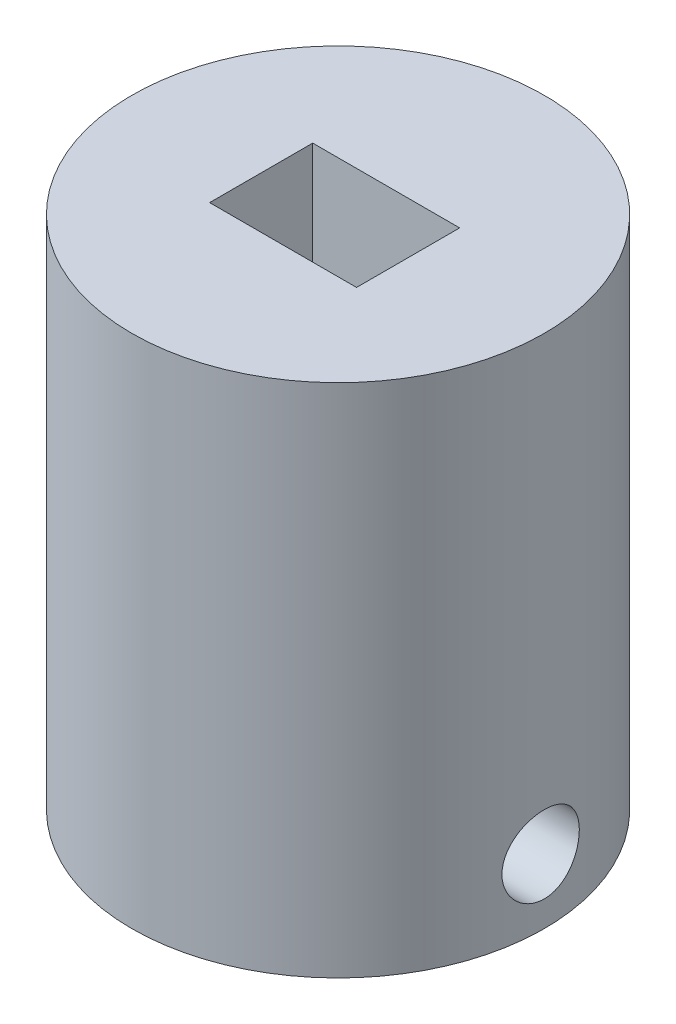
ISO-10303-21;
HEADER;
FILE_DESCRIPTION(('STEP AP214'),'2;1');
FILE_NAME('part.step','',(''),(''),'','','');
FILE_SCHEMA(('AUTOMOTIVE_DESIGN { 1 0 10303 214 1 1 1 1 }'));
ENDSEC;
DATA;
#1=APPLICATION_CONTEXT('core data for automotive mechanical design processes');
#2=APPLICATION_PROTOCOL_DEFINITION('international standard','automotive_design',2000,#1);
#3=PRODUCT_CONTEXT('',#1,'mechanical');
#4=PRODUCT('Part','Part','',(#3));
#5=PRODUCT_RELATED_PRODUCT_CATEGORY('part','',(#4));
#6=PRODUCT_DEFINITION_FORMATION('','',#4);
#7=PRODUCT_DEFINITION_CONTEXT('part definition',#1,'design');
#8=PRODUCT_DEFINITION('design','',#6,#7);
#9=PRODUCT_DEFINITION_SHAPE('','',#8);
#10=(LENGTH_UNIT() NAMED_UNIT(*) SI_UNIT(.MILLI.,.METRE.));
#11=(NAMED_UNIT(*) PLANE_ANGLE_UNIT() SI_UNIT($,.RADIAN.));
#12=(NAMED_UNIT(*) SI_UNIT($,.STERADIAN.) SOLID_ANGLE_UNIT());
#13=UNCERTAINTY_MEASURE_WITH_UNIT(LENGTH_MEASURE(1.E-05),#10,'distance_accuracy_value','');
#14=(GEOMETRIC_REPRESENTATION_CONTEXT(3) GLOBAL_UNCERTAINTY_ASSIGNED_CONTEXT((#13)) GLOBAL_UNIT_ASSIGNED_CONTEXT((#10,
#11,#12)) REPRESENTATION_CONTEXT('',''));
#15=CARTESIAN_POINT('',(0.,0.,0.));
#16=DIRECTION('',(0.,0.,1.));
#17=DIRECTION('',(1.,0.,0.));
#18=AXIS2_PLACEMENT_3D('',#15,#16,#17);
#19=CARTESIAN_POINT('',(0.,20.,0.));
#20=DIRECTION('',(0.,-1.,0.));
#21=DIRECTION('',(0.,0.,-1.));
#22=AXIS2_PLACEMENT_3D('',#19,#20,#21);
#23=CYLINDRICAL_SURFACE('',#22,8.);
#24=CARTESIAN_POINT('',(-8.,1.,0.));
#25=CARTESIAN_POINT('',(-7.99999848833852,1.00000318958828,-0.0834717464654709));
#26=CARTESIAN_POINT('',(-7.99868009921714,1.00699107661938,-0.166984992730098));
#27=CARTESIAN_POINT('',(-7.9935478589052,1.03473999511835,-0.331658129841798));
#28=CARTESIAN_POINT('',(-7.98973190166897,1.05551265063973,-0.412815974152226));
#29=CARTESIAN_POINT('',(-7.98003138765458,1.11017270125934,-0.570372961851801));
#30=CARTESIAN_POINT('',(-7.97414869946483,1.14404825245254,-0.646776330685344));
#31=CARTESIAN_POINT('',(-7.96095710599783,1.22391887692282,-0.792807973094006));
#32=CARTESIAN_POINT('',(-7.9536483161829,1.26991296914482,-0.862436794477323));
#33=CARTESIAN_POINT('',(-7.93831336430504,1.37329976800367,-0.993783715930503));
#34=CARTESIAN_POINT('',(-7.93028034856351,1.43080944467014,-1.05540895503183));
#35=CARTESIAN_POINT('',(-7.9144531845865,1.55534330908756,-1.16819606135369));
#36=CARTESIAN_POINT('',(-7.90665905354527,1.62236817976929,-1.21935717689241));
#37=CARTESIAN_POINT('',(-7.89212551245005,1.76468608836397,-1.31014998665793));
#38=CARTESIAN_POINT('',(-7.88539493886182,1.84004037031724,-1.34968721969605));
#39=CARTESIAN_POINT('',(-7.87384713211987,1.99646891517679,-1.41550524332283));
#40=CARTESIAN_POINT('',(-7.86902973396962,2.07754268411122,-1.44178717713098));
#41=CARTESIAN_POINT('',(-7.8619226957455,2.24211523091441,-1.480050535035));
#42=CARTESIAN_POINT('',(-7.85960445366405,2.32557509720346,-1.49219390192039));
#43=CARTESIAN_POINT('',(-7.85767197152761,2.49337738480825,-1.50233808095346));
#44=CARTESIAN_POINT('',(-7.8580574889876,2.5777197263023,-1.50034016135374));
#45=CARTESIAN_POINT('',(-7.86146292701753,2.74371952526605,-1.48238979602362));
#46=CARTESIAN_POINT('',(-7.86444808147334,2.82539771430015,-1.46662149996045));
#47=CARTESIAN_POINT('',(-7.87266183284666,2.98492841978261,-1.42186799396207));
#48=CARTESIAN_POINT('',(-7.87789052509516,3.0627807735093,-1.39288222239499));
#49=CARTESIAN_POINT('',(-7.89003855292589,3.21298867900027,-1.322336471793));
#50=CARTESIAN_POINT('',(-7.89696783823366,3.28530847058081,-1.28070213532456));
#51=CARTESIAN_POINT('',(-7.91172971602918,3.42200472854023,-1.18609368930416));
#52=CARTESIAN_POINT('',(-7.91956240015522,3.4863803877148,-1.13311842889266));
#53=CARTESIAN_POINT('',(-7.93540001272164,3.60642495567246,-1.01633905685298));
#54=CARTESIAN_POINT('',(-7.94340571024031,3.66194065245174,-0.952377436860682));
#55=CARTESIAN_POINT('',(-7.95857386108318,3.76147724067541,-0.815968037098826));
#56=CARTESIAN_POINT('',(-7.96573630595245,3.80549801687042,-0.743520172255769));
#57=CARTESIAN_POINT('',(-7.97842539677509,3.88081775387002,-0.592034988874667));
#58=CARTESIAN_POINT('',(-7.98394999136289,3.9121007791179,-0.512989564446493));
#59=CARTESIAN_POINT('',(-7.99272505402719,3.96090209309216,-0.350639115398696));
#60=CARTESIAN_POINT('',(-7.99597576367994,3.97842184404536,-0.267334544277786));
#61=CARTESIAN_POINT('',(-7.99980360641981,3.99898603101827,-0.100148652903384));
#62=CARTESIAN_POINT('',(-8.00041950912279,4.00224039152973,-0.0162940126341342));
#63=CARTESIAN_POINT('',(-7.99901543598228,3.99474452045235,0.150761248092185));
#64=CARTESIAN_POINT('',(-7.99699558964431,3.98399497693474,0.233961900480386));
#65=CARTESIAN_POINT('',(-7.99057111500406,3.94897096481663,0.396681573218218));
#66=CARTESIAN_POINT('',(-7.98618522374031,3.92480271746219,0.476224261046064));
#67=CARTESIAN_POINT('',(-7.97551842212498,3.86374229322121,0.630128631824634));
#68=CARTESIAN_POINT('',(-7.96923738311334,3.82684925243421,0.704489962595104));
#69=CARTESIAN_POINT('',(-7.95538030357666,3.74092187184049,0.846816671513215));
#70=CARTESIAN_POINT('',(-7.94779086174563,3.69175926146316,0.914703277015122));
#71=CARTESIAN_POINT('',(-7.93219343489711,3.58286186263764,1.04133832326455));
#72=CARTESIAN_POINT('',(-7.92418541084687,3.52312608699867,1.10008590976087));
#73=CARTESIAN_POINT('',(-7.9085247569745,3.39382768108857,1.20757295872048));
#74=CARTESIAN_POINT('',(-7.90087825860257,3.32414509187461,1.25616916218577));
#75=CARTESIAN_POINT('',(-7.88692985578532,3.17748237547625,1.34096675057787));
#76=CARTESIAN_POINT('',(-7.8806279013735,3.10050251962953,1.37716859613924));
#77=CARTESIAN_POINT('',(-7.87013024209574,2.94179413275746,1.43594673512823));
#78=CARTESIAN_POINT('',(-7.86592440436878,2.86009062044067,1.45858868794786));
#79=CARTESIAN_POINT('',(-7.86007203802415,2.6939527774786,1.48980679326235));
#80=CARTESIAN_POINT('',(-7.8584252206579,2.6095187560296,1.49838453270708));
#81=CARTESIAN_POINT('',(-7.85789199803857,2.44175166855849,1.50117762148355));
#82=CARTESIAN_POINT('',(-7.85896215974293,2.358422419043,1.49561895003499));
#83=CARTESIAN_POINT('',(-7.86364600659998,2.19390857795471,1.47079175378803));
#84=CARTESIAN_POINT('',(-7.86725967655747,2.11272397357256,1.45152331089332));
#85=CARTESIAN_POINT('',(-7.8766050802318,1.95492551520452,1.39991887583263));
#86=CARTESIAN_POINT('',(-7.88233284594965,1.87830340865423,1.36760735397252));
#87=CARTESIAN_POINT('',(-7.8952638755184,1.73153174575916,1.29085868912204));
#88=CARTESIAN_POINT('',(-7.90246724360119,1.66138264715522,1.24642068948186));
#89=CARTESIAN_POINT('',(-7.91767266107745,1.52841631995771,1.14589487339535));
#90=CARTESIAN_POINT('',(-7.92568505353043,1.4657245874329,1.08964259864303));
#91=CARTESIAN_POINT('',(-7.94152833918735,1.35059483753548,0.96742792674229));
#92=CARTESIAN_POINT('',(-7.94935919027328,1.29815917901986,0.901463301891614));
#93=CARTESIAN_POINT('',(-7.96403975968049,1.20458904737294,0.760984945071871));
#94=CARTESIAN_POINT('',(-7.97088000990561,1.16356057150936,0.686399590640516));
#95=CARTESIAN_POINT('',(-7.98271619380687,1.09468236339486,0.531290113653833));
#96=CARTESIAN_POINT('',(-7.98771385879037,1.06682025295309,0.450771651705247));
#97=CARTESIAN_POINT('',(-7.99428290707632,1.03072268558133,0.308347202825153));
#98=CARTESIAN_POINT('',(-7.99641470878206,1.0192213696872,0.24727381025187));
#99=CARTESIAN_POINT('',(-7.9992737995401,1.00385893788355,0.124141247115158));
#100=CARTESIAN_POINT('',(-8.00000112429805,0.999997627744093,0.0620821016527093));
#101=CARTESIAN_POINT('',(-8.,1.,0.));
#102=B_SPLINE_CURVE_WITH_KNOTS('',3,(#24,#25,#26,#27,#28,#29,#30,#31,#32,#33,#34,#35,#36,#37,
#38,#39,#40,#41,#42,#43,#44,#45,#46,#47,#48,#49,#50,#51,#52,#53,#54,#55,#56,#57,#58,#59,#60,#61,
#62,#63,#64,#65,#66,#67,#68,#69,#70,#71,#72,#73,#74,#75,#76,#77,#78,#79,#80,#81,#82,#83,#84,#85,
#86,#87,#88,#89,#90,#91,#92,#93,#94,#95,#96,#97,#98,#99,#100,#101),.UNSPECIFIED.,.T.,.F.,(4,2,2,
2,2,2,2,2,2,2,2,2,2,2,2,2,2,2,2,2,2,2,2,2,2,2,2,2,2,2,2,2,2,2,2,2,2,2,4),(0.,0.250188200964924,
0.500587642535452,0.750761271230907,1.00091465336891,1.2537511801363,1.50660586283617,
1.76146190504358,2.01629596311949,2.26818151445336,2.52004447587256,2.76859000612766,
3.01714609846787,3.26719262629531,3.51726454049859,3.77127768464077,4.02529337544948,
4.27962588321699,4.53393136673745,4.78448174076097,5.03501980464583,5.28360233907828,
5.53220175338032,5.78351778017708,6.03485728413098,6.28953436987299,6.54420198954945,
6.79762627818559,7.05102196946513,7.30039252231748,7.54976158541507,7.79866496207693,
8.04758592655423,8.3002336996638,8.55293951262255,8.80792048916314,9.06266126931173,
9.24874344524409,9.43482089039541),.UNSPECIFIED.);
#103=CARTESIAN_POINT('',(-8.,1.,0.));
#104=VERTEX_POINT('',#103);
#105=EDGE_CURVE('E129',#104,#104,#102,.T.);
#106=ORIENTED_EDGE('',*,*,#105,.T.);
#107=EDGE_LOOP('',(#106));
#108=FACE_BOUND('',#107,.T.);
#109=CARTESIAN_POINT('',(7.85811682275086,2.5,-1.5));
#110=CARTESIAN_POINT('',(7.85811843793494,2.41654279198826,-1.49999679883246));
#111=CARTESIAN_POINT('',(7.85946079760266,2.33304405178161,-1.49301126348936));
#112=CARTESIAN_POINT('',(7.86467851014364,2.16840103841809,-1.46527253251805));
#113=CARTESIAN_POINT('',(7.86855601173205,2.08725882357252,-1.44450765768477));
#114=CARTESIAN_POINT('',(7.87838976464885,1.92973492862913,-1.38987035617788));
#115=CARTESIAN_POINT('',(7.88434407905997,1.85334889069271,-1.35601013954374));
#116=CARTESIAN_POINT('',(7.89765826320959,1.70734644071319,-1.27617565760366));
#117=CARTESIAN_POINT('',(7.90501802325622,1.6377295009967,-1.23020233759193));
#118=CARTESIAN_POINT('',(7.92041614838944,1.50636980080087,-1.12683678942622));
#119=CARTESIAN_POINT('',(7.92846116625679,1.44472351652827,-1.06932292933092));
#120=CARTESIAN_POINT('',(7.94426457664034,1.33189561040044,-0.944771778803551));
#121=CARTESIAN_POINT('',(7.95202295031153,1.28071467557521,-0.877733863624944));
#122=CARTESIAN_POINT('',(7.96645017828405,1.18990062339948,-0.735403894570162));
#123=CARTESIAN_POINT('',(7.97311028052363,1.15035846648058,-0.660052840033866));
#124=CARTESIAN_POINT('',(7.98451608632931,1.08453045772647,-0.503631283250763));
#125=CARTESIAN_POINT('',(7.98926194728334,1.05824351600978,-0.422561251859506));
#126=CARTESIAN_POINT('',(7.99625755123778,1.01997045138887,-0.258002746187416));
#127=CARTESIAN_POINT('',(7.99853565976327,1.00782169407732,-0.174553323244857));
#128=CARTESIAN_POINT('',(8.00043684615594,0.997663112299599,-0.00677167603538324));
#129=CARTESIAN_POINT('',(8.00006015010697,0.999652083860943,0.0775604724476702));
#130=CARTESIAN_POINT('',(7.99671633763241,1.01758777114715,0.243598357899397));
#131=CARTESIAN_POINT('',(7.99378172247214,1.03335936943001,0.325323760451469));
#132=CARTESIAN_POINT('',(7.98568826333561,1.07813564939524,0.484947165715475));
#133=CARTESIAN_POINT('',(7.98052933829966,1.1071408133458,0.562845028826541));
#134=CARTESIAN_POINT('',(7.96851260297339,1.1777277310583,0.713110065751521));
#135=CARTESIAN_POINT('',(7.96164537590825,1.2193794879125,0.785443571838533));
#136=CARTESIAN_POINT('',(7.9469714754285,1.31402566907715,0.922159977214638));
#137=CARTESIAN_POINT('',(7.93916470651164,1.36702124688758,0.986542066910785));
#138=CARTESIAN_POINT('',(7.92333513680567,1.48381570298353,1.10656561896904));
#139=CARTESIAN_POINT('',(7.91531085901621,1.54776778390207,1.16205790757041));
#140=CARTESIAN_POINT('',(7.9000650892462,1.68414953127862,1.2615517185126));
#141=CARTESIAN_POINT('',(7.89284360901351,1.75657932176463,1.30555307271182));
#142=CARTESIAN_POINT('',(7.88001893307121,1.90805827070266,1.38085852224478));
#143=CARTESIAN_POINT('',(7.87441850530261,1.98711845719064,1.41214093645421));
#144=CARTESIAN_POINT('',(7.86551242396689,2.1495011841232,1.46093656975056));
#145=CARTESIAN_POINT('',(7.8622065103862,2.23282324046478,1.47845134901108));
#146=CARTESIAN_POINT('',(7.85831520301005,2.40001932885588,1.49899672649739));
#147=CARTESIAN_POINT('',(7.85768955816137,2.48386611556551,1.50224164285859));
#148=CARTESIAN_POINT('',(7.8591219142084,2.65090345508715,1.49472968881724));
#149=CARTESIAN_POINT('',(7.86117978238611,2.73409404014808,1.48397351086433));
#150=CARTESIAN_POINT('',(7.86770980063205,2.89675290305439,1.44894868195883));
#151=CARTESIAN_POINT('',(7.87216186690878,2.97624625262489,1.4247923858399));
#152=CARTESIAN_POINT('',(7.88296134156619,3.13005718973016,1.3637722437906));
#153=CARTESIAN_POINT('',(7.88930888963281,3.20437439531533,1.32690746128795));
#154=CARTESIAN_POINT('',(7.90327577863685,3.34666761904317,1.2410235311966));
#155=CARTESIAN_POINT('',(7.91090895425315,3.41456053786607,1.19186899639621));
#156=CARTESIAN_POINT('',(7.926548113681,3.54121204021433,1.08298344344247));
#157=CARTESIAN_POINT('',(7.93455413096494,3.59996980155577,1.02325147433084));
#158=CARTESIAN_POINT('',(7.95016624005946,3.70748376353413,0.893949417870386));
#159=CARTESIAN_POINT('',(7.95776555833305,3.75609582660596,0.824258534095891));
#160=CARTESIAN_POINT('',(7.97159404810351,3.84092120617766,0.677574523040141));
#161=CARTESIAN_POINT('',(7.97782327234725,3.87713500002501,0.600581677038529));
#162=CARTESIAN_POINT('',(7.98818057995848,3.93592009786408,0.441877541578684));
#163=CARTESIAN_POINT('',(7.99231954730142,3.95856218756141,0.360193213078988));
#164=CARTESIAN_POINT('',(7.99807642083745,3.98978704828989,0.194096227381571));
#165=CARTESIAN_POINT('',(7.99969459229933,3.99837129866271,0.109683858215851));
#166=CARTESIAN_POINT('',(8.00022227515441,4.00118530151844,-0.0580907602505092));
#167=CARTESIAN_POINT('',(7.99917286625032,3.99563275312953,-0.141449307066268));
#168=CARTESIAN_POINT('',(7.99456866611703,3.97080757223157,-0.306023369279199));
#169=CARTESIAN_POINT('',(7.99101389890671,3.95153507125579,-0.387238905213689));
#170=CARTESIAN_POINT('',(7.98179837978045,3.89990879261628,-0.545106475595484));
#171=CARTESIAN_POINT('',(7.97614135981576,3.86757818711899,-0.621766319318223));
#172=CARTESIAN_POINT('',(7.96333372068771,3.79077954634482,-0.768605631316694));
#173=CARTESIAN_POINT('',(7.95618300146483,3.74631069789335,-0.83878466500327));
#174=CARTESIAN_POINT('',(7.94104779859941,3.64574854555768,-0.971755027780006));
#175=CARTESIAN_POINT('',(7.93305284591272,3.58949796613829,-1.03442623539053));
#176=CARTESIAN_POINT('',(7.91719633538833,3.46729543750729,-1.14951536065485));
#177=CARTESIAN_POINT('',(7.90933480936765,3.40134120962628,-1.2019308632478));
#178=CARTESIAN_POINT('',(7.89455577425926,3.26087354529666,-1.29547633945385));
#179=CARTESIAN_POINT('',(7.88764767280729,3.18628656033236,-1.33649740531872));
#180=CARTESIAN_POINT('',(7.87567084650033,3.03117421002026,-1.40536132423417));
#181=CARTESIAN_POINT('',(7.87060038649116,2.95065453341062,-1.43321661638912));
#182=CARTESIAN_POINT('',(7.86393016292125,2.80824771193409,-1.46929726596175));
#183=CARTESIAN_POINT('',(7.86176310717932,2.74719427623806,-1.4807910573985));
#184=CARTESIAN_POINT('',(7.85885585595504,2.62410153157968,-1.49614351076215));
#185=CARTESIAN_POINT('',(7.85811562163282,2.56206224949967,-1.50000238052127));
#186=CARTESIAN_POINT('',(7.85811682275086,2.5,-1.5));
#187=B_SPLINE_CURVE_WITH_KNOTS('',3,(#109,#110,#111,#112,#113,#114,#115,#116,#117,#118,#119,
#120,#121,#122,#123,#124,#125,#126,#127,#128,#129,#130,#131,#132,#133,#134,#135,#136,#137,#138,
#139,#140,#141,#142,#143,#144,#145,#146,#147,#148,#149,#150,#151,#152,#153,#154,#155,#156,#157,
#158,#159,#160,#161,#162,#163,#164,#165,#166,#167,#168,#169,#170,#171,#172,#173,#174,#175,#176,
#177,#178,#179,#180,#181,#182,#183,#184,#185,#186),.UNSPECIFIED.,.T.,.F.,(4,2,2,2,2,2,2,2,2,2,2,
2,2,2,2,2,2,2,2,2,2,2,2,2,2,2,2,2,2,2,2,2,2,2,2,2,2,2,4),(0.,0.250144505793186,
0.500501302380393,0.750625227978432,1.00072963993908,1.25362335698691,1.50653367069315,
1.76137104348047,2.0161874593964,2.26804275460261,2.51987660200648,2.76855650598725,
3.01724547328425,3.26733691984219,3.51745380911785,3.77140614764064,4.025362201924,
4.27974936118266,4.53410768866488,4.78463248587075,5.03514489338718,5.28358792315368,
5.53204926624317,5.78337862654143,6.03473059394677,6.2894412549587,6.54414210821705,
6.79750269418683,7.0508366166733,7.30029300570138,7.54974700322167,7.79876026530357,
8.0477902135711,8.30038464008745,8.55303847730764,8.80803001818117,9.06278015749119,
9.24880307527214,9.43482092920425),.UNSPECIFIED.);
#188=CARTESIAN_POINT('',(7.85811682275086,2.5,-1.5));
#189=VERTEX_POINT('',#188);
#190=EDGE_CURVE('E123',#189,#189,#187,.T.);
#191=ORIENTED_EDGE('',*,*,#190,.T.);
#192=EDGE_LOOP('',(#191));
#193=FACE_BOUND('',#192,.T.);
#194=CARTESIAN_POINT('',(0.,20.,0.));
#195=DIRECTION('',(0.,1.,0.));
#196=DIRECTION('',(0.,0.,1.));
#197=AXIS2_PLACEMENT_3D('',#194,#195,#196);
#198=CIRCLE('',#197,8.);
#199=CARTESIAN_POINT('',(0.,20.,8.));
#200=VERTEX_POINT('',#199);
#201=EDGE_CURVE('E11',#200,#200,#198,.T.);
#202=ORIENTED_EDGE('',*,*,#201,.F.);
#203=EDGE_LOOP('',(#202));
#204=FACE_BOUND('',#203,.T.);
#205=CARTESIAN_POINT('',(0.,0.,0.));
#206=DIRECTION('',(0.,1.,0.));
#207=DIRECTION('',(0.,0.,1.));
#208=AXIS2_PLACEMENT_3D('',#205,#206,#207);
#209=CIRCLE('',#208,8.);
#210=CARTESIAN_POINT('',(0.,0.,8.));
#211=VERTEX_POINT('',#210);
#212=EDGE_CURVE('E51',#211,#211,#209,.T.);
#213=ORIENTED_EDGE('',*,*,#212,.T.);
#214=EDGE_LOOP('',(#213));
#215=FACE_BOUND('',#214,.T.);
#216=ADVANCED_FACE('F37',(#108,#193,#204,#215),#23,.T.);
#217=CARTESIAN_POINT('',(0.,20.,0.));
#218=DIRECTION('',(0.,1.,0.));
#219=DIRECTION('',(0.,0.,1.));
#220=AXIS2_PLACEMENT_3D('',#217,#218,#219);
#221=PLANE('',#220);
#222=DIRECTION('',(0.,0.,1.));
#223=VECTOR('',#222,1.);
#224=CARTESIAN_POINT('',(-2.88443974171694,20.,-1.90183485412021));
#225=LINE('',#224,#223);
#226=CARTESIAN_POINT('',(-2.88443974171694,20.,-1.90183485412021));
#227=VERTEX_POINT('',#226);
#228=CARTESIAN_POINT('',(-2.88443974171694,20.,2.09816514587979));
#229=VERTEX_POINT('',#228);
#230=EDGE_CURVE('E59',#227,#229,#225,.T.);
#231=ORIENTED_EDGE('',*,*,#230,.F.);
#232=DIRECTION('',(-1.,0.,0.));
#233=VECTOR('',#232,1.);
#234=CARTESIAN_POINT('',(-2.88443974171694,20.,-1.90183485412021));
#235=LINE('',#234,#233);
#236=CARTESIAN_POINT('',(2.81556025828306,20.,-1.90183485412021));
#237=VERTEX_POINT('',#236);
#238=EDGE_CURVE('E110',#237,#227,#235,.T.);
#239=ORIENTED_EDGE('',*,*,#238,.F.);
#240=DIRECTION('',(0.,0.,-1.));
#241=VECTOR('',#240,1.);
#242=CARTESIAN_POINT('',(2.81556025828306,20.,-1.90183485412021));
#243=LINE('',#242,#241);
#244=CARTESIAN_POINT('',(2.81556025828306,20.,2.09816514587979));
#245=VERTEX_POINT('',#244);
#246=EDGE_CURVE('E116',#245,#237,#243,.T.);
#247=ORIENTED_EDGE('',*,*,#246,.F.);
#248=DIRECTION('',(1.,0.,0.));
#249=VECTOR('',#248,1.);
#250=CARTESIAN_POINT('',(-2.88443974171694,20.,2.09816514587979));
#251=LINE('',#250,#249);
#252=EDGE_CURVE('E94',#229,#245,#251,.T.);
#253=ORIENTED_EDGE('',*,*,#252,.F.);
#254=EDGE_LOOP('',(#231,#239,#247,#253));
#255=FACE_BOUND('',#254,.T.);
#256=ORIENTED_EDGE('',*,*,#201,.T.);
#257=EDGE_LOOP('',(#256));
#258=FACE_BOUND('',#257,.T.);
#259=ADVANCED_FACE('F158',(#255,#258),#221,.T.);
#260=CARTESIAN_POINT('',(0.,0.,0.));
#261=DIRECTION('',(0.,1.,0.));
#262=DIRECTION('',(0.,0.,1.));
#263=AXIS2_PLACEMENT_3D('',#260,#261,#262);
#264=PLANE('',#263);
#265=CARTESIAN_POINT('',(0.,0.,0.));
#266=DIRECTION('',(0.,-1.,0.));
#267=DIRECTION('',(0.,0.,-1.));
#268=AXIS2_PLACEMENT_3D('',#265,#266,#267);
#269=CIRCLE('',#268,4.);
#270=CARTESIAN_POINT('',(0.,0.,-4.));
#271=VERTEX_POINT('',#270);
#272=EDGE_CURVE('E183',#271,#271,#269,.T.);
#273=ORIENTED_EDGE('',*,*,#272,.F.);
#274=EDGE_LOOP('',(#273));
#275=FACE_BOUND('',#274,.T.);
#276=ORIENTED_EDGE('',*,*,#212,.F.);
#277=EDGE_LOOP('',(#276));
#278=FACE_BOUND('',#277,.T.);
#279=ADVANCED_FACE('F156',(#275,#278),#264,.F.);
#280=CARTESIAN_POINT('',(0.,12.,0.));
#281=DIRECTION('',(0.,-1.,0.));
#282=DIRECTION('',(0.,0.,-1.));
#283=AXIS2_PLACEMENT_3D('',#280,#281,#282);
#284=CYLINDRICAL_SURFACE('',#283,4.);
#285=CARTESIAN_POINT('',(-3.70809924354783,2.5,-1.5));
#286=CARTESIAN_POINT('',(-3.70809640633806,2.41899251627921,-1.50000304106109));
#287=CARTESIAN_POINT('',(-3.71078260240986,2.33800507749636,-1.49341597549487));
#288=CARTESIAN_POINT('',(-3.72116159304967,2.1784719170868,-1.46736187895468));
#289=CARTESIAN_POINT('',(-3.72885423767112,2.09992612240499,-1.44789523373263));
#290=CARTESIAN_POINT('',(-3.748254802809,1.94762462838647,-1.39689657610574));
#291=CARTESIAN_POINT('',(-3.7599530956926,1.87385794334892,-1.36539347266348));
#292=CARTESIAN_POINT('',(-3.78603134206598,1.73262810318116,-1.29131856742698));
#293=CARTESIAN_POINT('',(-3.80041210067323,1.66516684971748,-1.24874344095039));
#294=CARTESIAN_POINT('',(-3.83103574665713,1.53510968837718,-1.15146661374162));
#295=CARTESIAN_POINT('',(-3.84733341923603,1.47287147037061,-1.09630381213306));
#296=CARTESIAN_POINT('',(-3.87949750628547,1.35827718532851,-0.976395839778926));
#297=CARTESIAN_POINT('',(-3.89536382814785,1.30592322625815,-0.91164863025668));
#298=CARTESIAN_POINT('',(-3.92552873936553,1.21086048770439,-0.7716946551776));
#299=CARTESIAN_POINT('',(-3.93975561223505,1.16854052528414,-0.696206947538028));
#300=CARTESIAN_POINT('',(-3.96438007973848,1.09734882747509,-0.538555771965247));
#301=CARTESIAN_POINT('',(-3.97477900217006,1.06847242800803,-0.456394630933536));
#302=CARTESIAN_POINT('',(-3.9901869710344,1.02624210422538,-0.291489341676832));
#303=CARTESIAN_POINT('',(-3.99540915214774,1.01227237255954,-0.208923197281596));
#304=CARTESIAN_POINT('',(-4.0006401410794,0.998278799055012,-0.042464363794786));
#305=CARTESIAN_POINT('',(-4.00065064414902,0.998250422381291,0.041427885062833));
#306=CARTESIAN_POINT('',(-3.99559265903894,1.01178176146517,0.203743543064476));
#307=CARTESIAN_POINT('',(-3.99077541996683,1.02466929794882,0.2822321782669));
#308=CARTESIAN_POINT('',(-3.97693274932263,1.06253591522555,0.435839217984391));
#309=CARTESIAN_POINT('',(-3.96790701975578,1.08751585226204,0.510957383430298));
#310=CARTESIAN_POINT('',(-3.94637769167531,1.14917045167585,0.656989017303104));
#311=CARTESIAN_POINT('',(-3.93382539470077,1.18601000526841,0.727825392287309));
#312=CARTESIAN_POINT('',(-3.90651310225279,1.27019209692939,0.862486607957559));
#313=CARTESIAN_POINT('',(-3.8917523951284,1.3175380230176,0.926309176932322));
#314=CARTESIAN_POINT('',(-3.86052529655816,1.42462728628319,1.04909048680093));
#315=CARTESIAN_POINT('',(-3.84400963763883,1.48493391565043,1.10754614526348));
#316=CARTESIAN_POINT('',(-3.81182460645722,1.61459299332156,1.21370395569342));
#317=CARTESIAN_POINT('',(-3.79615544748847,1.68394770658664,1.261403406929));
#318=CARTESIAN_POINT('',(-3.76712703500335,1.83171946746282,1.34565611808151));
#319=CARTESIAN_POINT('',(-3.75382677150277,1.91030349368607,1.38193847851831));
#320=CARTESIAN_POINT('',(-3.73172438629002,2.07309622516757,1.44056464441501));
#321=CARTESIAN_POINT('',(-3.72291976205783,2.15730177159369,1.46291620605595));
#322=CARTESIAN_POINT('',(-3.71139597222848,2.32397596231595,1.49190191709668));
#323=CARTESIAN_POINT('',(-3.70836785241537,2.40628410553614,1.49933521158966));
#324=CARTESIAN_POINT('',(-3.70786539525016,2.57100935674174,1.50057885636272));
#325=CARTESIAN_POINT('',(-3.71038967003987,2.65342643235247,1.49439261093762));
#326=CARTESIAN_POINT('',(-3.72039381629735,2.81192992228768,1.46929733520157));
#327=CARTESIAN_POINT('',(-3.72763276216449,2.88813113576466,1.45100618334225));
#328=CARTESIAN_POINT('',(-3.74596487046361,3.03634794472019,1.40299774640638));
#329=CARTESIAN_POINT('',(-3.75705882250173,3.10836267916813,1.37327812034623));
#330=CARTESIAN_POINT('',(-3.7823624311608,3.2491644380762,1.30200292275278));
#331=CARTESIAN_POINT('',(-3.79667328892065,3.31772929213734,1.26004545177047));
#332=CARTESIAN_POINT('',(-3.82662814294291,3.44712898172604,1.16591317862479));
#333=CARTESIAN_POINT('',(-3.84227262594077,3.50796097462463,1.11373463696435));
#334=CARTESIAN_POINT('',(-3.87433046553184,3.6241683731951,0.996727340900939));
#335=CARTESIAN_POINT('',(-3.89072969357028,3.67895340876875,0.931306341491063));
#336=CARTESIAN_POINT('',(-3.92149874963302,3.77683836758944,0.791797471753152));
#337=CARTESIAN_POINT('',(-3.93586857107664,3.81993825294584,0.717709573322674));
#338=CARTESIAN_POINT('',(-3.96094985704552,3.89294605619961,0.563016329468477));
#339=CARTESIAN_POINT('',(-3.9716738133801,3.9228991237926,0.482434433064627));
#340=CARTESIAN_POINT('',(-3.98829436712571,3.96865641384992,0.316881887523255));
#341=CARTESIAN_POINT('',(-3.99419323299412,3.9844672854224,0.231913320723594));
#342=CARTESIAN_POINT('',(-4.00028407317073,4.00077440275483,0.0653355852738163));
#343=CARTESIAN_POINT('',(-4.00078860953764,4.00210948305899,-0.0161807680608445));
#344=CARTESIAN_POINT('',(-3.99684889809223,3.99158484055461,-0.178226786412423));
#345=CARTESIAN_POINT('',(-3.9924052471313,3.97972670911414,-0.258756569245256));
#346=CARTESIAN_POINT('',(-3.97921089603771,3.94374114850638,-0.414548248377125));
#347=CARTESIAN_POINT('',(-3.97056791378017,3.91992009412164,-0.489890731068834));
#348=CARTESIAN_POINT('',(-3.9498778362099,3.86098998661564,-0.635515473006389));
#349=CARTESIAN_POINT('',(-3.93783009655664,3.82587879669525,-0.705796771275542));
#350=CARTESIAN_POINT('',(-3.91090618300074,3.74368605649519,-0.842540176994412));
#351=CARTESIAN_POINT('',(-3.89593240108828,3.69616335948585,-0.908717548846848));
#352=CARTESIAN_POINT('',(-3.86499507694844,3.5911921698124,-1.03241734752336));
#353=CARTESIAN_POINT('',(-3.84903118274027,3.53374013419213,-1.0899366712559));
#354=CARTESIAN_POINT('',(-3.81688129739175,3.40693586835494,-1.19781214236196));
#355=CARTESIAN_POINT('',(-3.8007280534916,3.33711559784569,-1.24762999816025));
#356=CARTESIAN_POINT('',(-3.77098325003638,3.18958413042668,-1.33484709556843));
#357=CARTESIAN_POINT('',(-3.75739195631216,3.11187211594652,-1.37224504878157));
#358=CARTESIAN_POINT('',(-3.73402269853266,2.9470443190246,-1.4346588697426));
#359=CARTESIAN_POINT('',(-3.7244380329086,2.85966563348822,-1.45906002899523));
#360=CARTESIAN_POINT('',(-3.71147994336315,2.68151472804421,-1.49172356722079));
#361=CARTESIAN_POINT('',(-3.70810242179736,2.59074478729001,-1.49999659339571));
#362=CARTESIAN_POINT('',(-3.70809924354783,2.5,-1.5));
#363=B_SPLINE_CURVE_WITH_KNOTS('',3,(#285,#286,#287,#288,#289,#290,#291,#292,#293,#294,#295,
#296,#297,#298,#299,#300,#301,#302,#303,#304,#305,#306,#307,#308,#309,#310,#311,#312,#313,#314,
#315,#316,#317,#318,#319,#320,#321,#322,#323,#324,#325,#326,#327,#328,#329,#330,#331,#332,#333,
#334,#335,#336,#337,#338,#339,#340,#341,#342,#343,#344,#345,#346,#347,#348,#349,#350,#351,#352,
#353,#354,#355,#356,#357,#358,#359,#360,#361,#362),.UNSPECIFIED.,.T.,.F.,(4,2,2,2,2,2,2,2,2,2,2,
2,2,2,2,2,2,2,2,2,2,2,2,2,2,2,2,2,2,2,2,2,2,2,2,2,2,2,4),(0.,0.24268454141617,0.485361814598854,
0.72745985675703,0.969630679682933,1.22274652401128,1.47591628822983,1.73770072136421,
1.9993942638133,2.24980018489679,2.50012465404857,2.73806472803194,2.97602165263335,
3.21744131210668,3.45893893628976,3.71456675065874,3.97025867827334,4.23162592252966,
4.49284751635474,4.73965657740485,4.98640395388884,5.22143845928198,5.45652113429526,
5.70041561005821,5.94439948466355,6.20385016993624,6.46330169650178,6.72185508890168,
6.98028685560127,7.22365720549936,7.46699820319479,7.7044027400389,7.94185223512831,
8.18928323676986,8.43680270894964,8.69738599542079,8.95799630544242,9.23003178870926,
9.50188762323053),.UNSPECIFIED.);
#364=CARTESIAN_POINT('',(-3.70809924354783,2.5,-1.5));
#365=VERTEX_POINT('',#364);
#366=EDGE_CURVE('E41',#365,#365,#363,.T.);
#367=ORIENTED_EDGE('',*,*,#366,.T.);
#368=EDGE_LOOP('',(#367));
#369=FACE_BOUND('',#368,.T.);
#370=CARTESIAN_POINT('',(3.70809924354783,2.5,-1.5));
#371=CARTESIAN_POINT('',(3.70809640633806,2.58100748372079,-1.50000304106109));
#372=CARTESIAN_POINT('',(3.71078260240986,2.66199492250364,-1.49341597549487));
#373=CARTESIAN_POINT('',(3.72116159304967,2.8215280829132,-1.46736187895468));
#374=CARTESIAN_POINT('',(3.72885423767112,2.90007387759501,-1.44789523373263));
#375=CARTESIAN_POINT('',(3.748254802809,3.05237537161353,-1.39689657610574));
#376=CARTESIAN_POINT('',(3.7599530956926,3.12614205665108,-1.36539347266348));
#377=CARTESIAN_POINT('',(3.78603134206598,3.26737189681884,-1.29131856742698));
#378=CARTESIAN_POINT('',(3.80041210067323,3.33483315028252,-1.24874344095039));
#379=CARTESIAN_POINT('',(3.83103574665713,3.46489031162282,-1.15146661374162));
#380=CARTESIAN_POINT('',(3.84733341923603,3.52712852962939,-1.09630381213306));
#381=CARTESIAN_POINT('',(3.87949750628547,3.64172281467149,-0.976395839778926));
#382=CARTESIAN_POINT('',(3.89536382814785,3.69407677374185,-0.911648630256679));
#383=CARTESIAN_POINT('',(3.92552873936553,3.78913951229561,-0.7716946551776));
#384=CARTESIAN_POINT('',(3.93975561223505,3.83145947471586,-0.696206947538028));
#385=CARTESIAN_POINT('',(3.96438007973848,3.90265117252491,-0.538555771965247));
#386=CARTESIAN_POINT('',(3.97477900217006,3.93152757199197,-0.456394630933536));
#387=CARTESIAN_POINT('',(3.9901869710344,3.97375789577462,-0.291489341676832));
#388=CARTESIAN_POINT('',(3.99540915214774,3.98772762744046,-0.208923197281596));
#389=CARTESIAN_POINT('',(4.0006401410794,4.00172120094499,-0.0424643637947863));
#390=CARTESIAN_POINT('',(4.00065064414902,4.00174957761871,0.0414278850628327));
#391=CARTESIAN_POINT('',(3.99559265903894,3.98821823853483,0.203743543064476));
#392=CARTESIAN_POINT('',(3.99077541996683,3.97533070205119,0.2822321782669));
#393=CARTESIAN_POINT('',(3.97693274932263,3.93746408477445,0.435839217984391));
#394=CARTESIAN_POINT('',(3.96790701975578,3.91248414773796,0.510957383430298));
#395=CARTESIAN_POINT('',(3.94637769167531,3.85082954832415,0.656989017303103));
#396=CARTESIAN_POINT('',(3.93382539470077,3.81398999473159,0.727825392287308));
#397=CARTESIAN_POINT('',(3.90651310225279,3.72980790307061,0.862486607957558));
#398=CARTESIAN_POINT('',(3.8917523951284,3.6824619769824,0.926309176932322));
#399=CARTESIAN_POINT('',(3.86052529655816,3.57537271371681,1.04909048680093));
#400=CARTESIAN_POINT('',(3.84400963763883,3.51506608434957,1.10754614526348));
#401=CARTESIAN_POINT('',(3.81182460645722,3.38540700667844,1.21370395569342));
#402=CARTESIAN_POINT('',(3.79615544748847,3.31605229341336,1.261403406929));
#403=CARTESIAN_POINT('',(3.76712703500335,3.16828053253718,1.34565611808151));
#404=CARTESIAN_POINT('',(3.75382677150277,3.08969650631393,1.38193847851831));
#405=CARTESIAN_POINT('',(3.73172438629002,2.92690377483243,1.44056464441501));
#406=CARTESIAN_POINT('',(3.72291976205783,2.84269822840631,1.46291620605595));
#407=CARTESIAN_POINT('',(3.71139597222848,2.67602403768405,1.49190191709668));
#408=CARTESIAN_POINT('',(3.70836785241537,2.59371589446386,1.49933521158966));
#409=CARTESIAN_POINT('',(3.70786539525016,2.42899064325826,1.50057885636272));
#410=CARTESIAN_POINT('',(3.71038967003987,2.34657356764753,1.49439261093762));
#411=CARTESIAN_POINT('',(3.72039381629735,2.18807007771232,1.46929733520157));
#412=CARTESIAN_POINT('',(3.72763276216449,2.11186886423534,1.45100618334225));
#413=CARTESIAN_POINT('',(3.74596487046362,1.96365205527981,1.40299774640638));
#414=CARTESIAN_POINT('',(3.75705882250173,1.89163732083187,1.37327812034623));
#415=CARTESIAN_POINT('',(3.7823624311608,1.7508355619238,1.30200292275278));
#416=CARTESIAN_POINT('',(3.79667328892065,1.68227070786266,1.26004545177047));
#417=CARTESIAN_POINT('',(3.82662814294291,1.55287101827396,1.16591317862479));
#418=CARTESIAN_POINT('',(3.84227262594077,1.49203902537537,1.11373463696435));
#419=CARTESIAN_POINT('',(3.87433046553184,1.3758316268049,0.996727340900938));
#420=CARTESIAN_POINT('',(3.89072969357028,1.32104659123125,0.931306341491062));
#421=CARTESIAN_POINT('',(3.92149874963302,1.22316163241056,0.791797471753152));
#422=CARTESIAN_POINT('',(3.93586857107664,1.18006174705416,0.717709573322674));
#423=CARTESIAN_POINT('',(3.96094985704552,1.10705394380039,0.563016329468478));
#424=CARTESIAN_POINT('',(3.9716738133801,1.0771008762074,0.482434433064628));
#425=CARTESIAN_POINT('',(3.98829436712571,1.03134358615008,0.316881887523256));
#426=CARTESIAN_POINT('',(3.99419323299412,1.0155327145776,0.231913320723594));
#427=CARTESIAN_POINT('',(4.00028407317073,0.999225597245175,0.0653355852738162));
#428=CARTESIAN_POINT('',(4.00078860953764,0.997890516941009,-0.0161807680608447));
#429=CARTESIAN_POINT('',(3.99684889809223,1.00841515944539,-0.178226786412423));
#430=CARTESIAN_POINT('',(3.9924052471313,1.02027329088586,-0.258756569245256));
#431=CARTESIAN_POINT('',(3.97921089603771,1.05625885149362,-0.414548248377125));
#432=CARTESIAN_POINT('',(3.97056791378017,1.08007990587836,-0.489890731068834));
#433=CARTESIAN_POINT('',(3.9498778362099,1.13901001338436,-0.635515473006389));
#434=CARTESIAN_POINT('',(3.93783009655664,1.17412120330475,-0.705796771275542));
#435=CARTESIAN_POINT('',(3.91090618300074,1.25631394350481,-0.842540176994412));
#436=CARTESIAN_POINT('',(3.89593240108829,1.30383664051415,-0.908717548846849));
#437=CARTESIAN_POINT('',(3.86499507694844,1.4088078301876,-1.03241734752336));
#438=CARTESIAN_POINT('',(3.84903118274027,1.46625986580787,-1.0899366712559));
#439=CARTESIAN_POINT('',(3.81688129739175,1.59306413164506,-1.19781214236196));
#440=CARTESIAN_POINT('',(3.8007280534916,1.66288440215431,-1.24762999816025));
#441=CARTESIAN_POINT('',(3.77098325003638,1.81041586957332,-1.33484709556843));
#442=CARTESIAN_POINT('',(3.75739195631216,1.88812788405348,-1.37224504878157));
#443=CARTESIAN_POINT('',(3.73402269853266,2.0529556809754,-1.4346588697426));
#444=CARTESIAN_POINT('',(3.7244380329086,2.14033436651178,-1.45906002899523));
#445=CARTESIAN_POINT('',(3.71147994336315,2.31848527195579,-1.49172356722079));
#446=CARTESIAN_POINT('',(3.70810242179736,2.40925521270999,-1.49999659339571));
#447=CARTESIAN_POINT('',(3.70809924354783,2.5,-1.5));
#448=B_SPLINE_CURVE_WITH_KNOTS('',3,(#370,#371,#372,#373,#374,#375,#376,#377,#378,#379,#380,
#381,#382,#383,#384,#385,#386,#387,#388,#389,#390,#391,#392,#393,#394,#395,#396,#397,#398,#399,
#400,#401,#402,#403,#404,#405,#406,#407,#408,#409,#410,#411,#412,#413,#414,#415,#416,#417,#418,
#419,#420,#421,#422,#423,#424,#425,#426,#427,#428,#429,#430,#431,#432,#433,#434,#435,#436,#437,
#438,#439,#440,#441,#442,#443,#444,#445,#446,#447),.UNSPECIFIED.,.T.,.F.,(4,2,2,2,2,2,2,2,2,2,2,
2,2,2,2,2,2,2,2,2,2,2,2,2,2,2,2,2,2,2,2,2,2,2,2,2,2,2,4),(0.,0.24268454141617,0.485361814598854,
0.72745985675703,0.969630679682933,1.22274652401128,1.47591628822983,1.73770072136421,
1.9993942638133,2.24980018489679,2.50012465404857,2.73806472803194,2.97602165263335,
3.21744131210668,3.45893893628976,3.71456675065874,3.97025867827335,4.23162592252966,
4.49284751635474,4.73965657740485,4.98640395388884,5.22143845928198,5.45652113429526,
5.70041561005821,5.94439948466355,6.20385016993624,6.46330169650178,6.72185508890168,
6.98028685560127,7.22365720549936,7.46699820319479,7.7044027400389,7.94185223512831,
8.18928323676987,8.43680270894964,8.69738599542079,8.95799630544242,9.23003178870926,
9.50188762323053),.UNSPECIFIED.);
#449=CARTESIAN_POINT('',(3.70809924354783,2.5,-1.5));
#450=VERTEX_POINT('',#449);
#451=EDGE_CURVE('E120',#450,#450,#448,.T.);
#452=ORIENTED_EDGE('',*,*,#451,.T.);
#453=EDGE_LOOP('',(#452));
#454=FACE_BOUND('',#453,.T.);
#455=CARTESIAN_POINT('',(0.,12.,0.));
#456=DIRECTION('',(0.,-1.,0.));
#457=DIRECTION('',(0.,0.,-1.));
#458=AXIS2_PLACEMENT_3D('',#455,#456,#457);
#459=CIRCLE('',#458,4.);
#460=CARTESIAN_POINT('',(0.,12.,-4.));
#461=VERTEX_POINT('',#460);
#462=EDGE_CURVE('E181',#461,#461,#459,.T.);
#463=ORIENTED_EDGE('',*,*,#462,.F.);
#464=EDGE_LOOP('',(#463));
#465=FACE_BOUND('',#464,.T.);
#466=ORIENTED_EDGE('',*,*,#272,.T.);
#467=EDGE_LOOP('',(#466));
#468=FACE_BOUND('',#467,.T.);
#469=ADVANCED_FACE('F152',(#369,#454,#465,#468),#284,.F.);
#470=CARTESIAN_POINT('',(0.,12.,0.));
#471=DIRECTION('',(0.,-1.,0.));
#472=DIRECTION('',(0.,0.,-1.));
#473=AXIS2_PLACEMENT_3D('',#470,#471,#472);
#474=PLANE('',#473);
#475=ORIENTED_EDGE('',*,*,#462,.T.);
#476=EDGE_LOOP('',(#475));
#477=FACE_BOUND('',#476,.T.);
#478=ADVANCED_FACE('F143',(#477),#474,.T.);
#479=CARTESIAN_POINT('',(-8.,2.5,0.));
#480=DIRECTION('',(1.,0.,0.));
#481=DIRECTION('',(0.,0.,-1.));
#482=AXIS2_PLACEMENT_3D('',#479,#480,#481);
#483=CYLINDRICAL_SURFACE('',#482,1.5);
#484=ORIENTED_EDGE('',*,*,#451,.F.);
#485=EDGE_LOOP('',(#484));
#486=FACE_BOUND('',#485,.T.);
#487=ORIENTED_EDGE('',*,*,#190,.F.);
#488=EDGE_LOOP('',(#487));
#489=FACE_BOUND('',#488,.T.);
#490=ADVANCED_FACE('F140',(#486,#489),#483,.F.);
#491=ORIENTED_EDGE('',*,*,#366,.F.);
#492=EDGE_LOOP('',(#491));
#493=FACE_BOUND('',#492,.T.);
#494=ORIENTED_EDGE('',*,*,#105,.F.);
#495=EDGE_LOOP('',(#494));
#496=FACE_BOUND('',#495,.T.);
#497=ADVANCED_FACE('F134',(#493,#496),#483,.F.);
#498=CARTESIAN_POINT('',(-2.88443974171694,14.,-1.90183485412021));
#499=DIRECTION('',(-1.,0.,0.));
#500=DIRECTION('',(0.,0.,1.));
#501=AXIS2_PLACEMENT_3D('',#498,#499,#500);
#502=PLANE('',#501);
#503=ORIENTED_EDGE('',*,*,#230,.T.);
#504=DIRECTION('',(0.,1.,0.));
#505=VECTOR('',#504,1.);
#506=CARTESIAN_POINT('',(-2.88443974171694,14.,2.09816514587979));
#507=LINE('',#506,#505);
#508=CARTESIAN_POINT('',(-2.88443974171694,14.,2.09816514587979));
#509=VERTEX_POINT('',#508);
#510=EDGE_CURVE('E82',#509,#229,#507,.T.);
#511=ORIENTED_EDGE('',*,*,#510,.F.);
#512=DIRECTION('',(0.,0.,1.));
#513=VECTOR('',#512,1.);
#514=CARTESIAN_POINT('',(-2.88443974171694,14.,-1.90183485412021));
#515=LINE('',#514,#513);
#516=CARTESIAN_POINT('',(-2.88443974171694,14.,-1.90183485412021));
#517=VERTEX_POINT('',#516);
#518=EDGE_CURVE('E108',#517,#509,#515,.T.);
#519=ORIENTED_EDGE('',*,*,#518,.F.);
#520=DIRECTION('',(0.,1.,0.));
#521=VECTOR('',#520,1.);
#522=CARTESIAN_POINT('',(-2.88443974171694,14.,-1.90183485412021));
#523=LINE('',#522,#521);
#524=EDGE_CURVE('E67',#517,#227,#523,.T.);
#525=ORIENTED_EDGE('',*,*,#524,.T.);
#526=EDGE_LOOP('',(#503,#511,#519,#525));
#527=FACE_BOUND('',#526,.T.);
#528=ADVANCED_FACE('F139',(#527),#502,.F.);
#529=CARTESIAN_POINT('',(-2.88443974171694,14.,-1.90183485412021));
#530=DIRECTION('',(0.,0.,-1.));
#531=DIRECTION('',(-1.,0.,0.));
#532=AXIS2_PLACEMENT_3D('',#529,#530,#531);
#533=PLANE('',#532);
#534=ORIENTED_EDGE('',*,*,#238,.T.);
#535=ORIENTED_EDGE('',*,*,#524,.F.);
#536=DIRECTION('',(-1.,0.,0.));
#537=VECTOR('',#536,1.);
#538=CARTESIAN_POINT('',(-2.88443974171694,14.,-1.90183485412021));
#539=LINE('',#538,#537);
#540=CARTESIAN_POINT('',(2.81556025828306,14.,-1.90183485412021));
#541=VERTEX_POINT('',#540);
#542=EDGE_CURVE('E105',#541,#517,#539,.T.);
#543=ORIENTED_EDGE('',*,*,#542,.F.);
#544=DIRECTION('',(0.,1.,0.));
#545=VECTOR('',#544,1.);
#546=CARTESIAN_POINT('',(2.81556025828306,14.,-1.90183485412021));
#547=LINE('',#546,#545);
#548=EDGE_CURVE('E98',#541,#237,#547,.T.);
#549=ORIENTED_EDGE('',*,*,#548,.T.);
#550=EDGE_LOOP('',(#534,#535,#543,#549));
#551=FACE_BOUND('',#550,.T.);
#552=ADVANCED_FACE('F212',(#551),#533,.F.);
#553=CARTESIAN_POINT('',(2.81556025828306,14.,-1.90183485412021));
#554=DIRECTION('',(1.,0.,0.));
#555=DIRECTION('',(0.,0.,-1.));
#556=AXIS2_PLACEMENT_3D('',#553,#554,#555);
#557=PLANE('',#556);
#558=ORIENTED_EDGE('',*,*,#246,.T.);
#559=ORIENTED_EDGE('',*,*,#548,.F.);
#560=DIRECTION('',(0.,0.,-1.));
#561=VECTOR('',#560,1.);
#562=CARTESIAN_POINT('',(2.81556025828306,14.,-1.90183485412021));
#563=LINE('',#562,#561);
#564=CARTESIAN_POINT('',(2.81556025828306,14.,2.09816514587979));
#565=VERTEX_POINT('',#564);
#566=EDGE_CURVE('E101',#565,#541,#563,.T.);
#567=ORIENTED_EDGE('',*,*,#566,.F.);
#568=DIRECTION('',(0.,1.,0.));
#569=VECTOR('',#568,1.);
#570=CARTESIAN_POINT('',(2.81556025828306,14.,2.09816514587979));
#571=LINE('',#570,#569);
#572=EDGE_CURVE('E87',#565,#245,#571,.T.);
#573=ORIENTED_EDGE('',*,*,#572,.T.);
#574=EDGE_LOOP('',(#558,#559,#567,#573));
#575=FACE_BOUND('',#574,.T.);
#576=ADVANCED_FACE('F102',(#575),#557,.F.);
#577=CARTESIAN_POINT('',(-2.88443974171694,14.,2.09816514587979));
#578=DIRECTION('',(0.,0.,1.));
#579=DIRECTION('',(1.,0.,0.));
#580=AXIS2_PLACEMENT_3D('',#577,#578,#579);
#581=PLANE('',#580);
#582=ORIENTED_EDGE('',*,*,#252,.T.);
#583=ORIENTED_EDGE('',*,*,#572,.F.);
#584=DIRECTION('',(1.,0.,0.));
#585=VECTOR('',#584,1.);
#586=CARTESIAN_POINT('',(-2.88443974171694,14.,2.09816514587979));
#587=LINE('',#586,#585);
#588=EDGE_CURVE('E91',#509,#565,#587,.T.);
#589=ORIENTED_EDGE('',*,*,#588,.F.);
#590=ORIENTED_EDGE('',*,*,#510,.T.);
#591=EDGE_LOOP('',(#582,#583,#589,#590));
#592=FACE_BOUND('',#591,.T.);
#593=ADVANCED_FACE('F89',(#592),#581,.F.);
#594=CARTESIAN_POINT('',(0.,14.,0.));
#595=DIRECTION('',(0.,1.,0.));
#596=DIRECTION('',(0.,0.,1.));
#597=AXIS2_PLACEMENT_3D('',#594,#595,#596);
#598=PLANE('',#597);
#599=ORIENTED_EDGE('',*,*,#518,.T.);
#600=ORIENTED_EDGE('',*,*,#588,.T.);
#601=ORIENTED_EDGE('',*,*,#566,.T.);
#602=ORIENTED_EDGE('',*,*,#542,.T.);
#603=EDGE_LOOP('',(#599,#600,#601,#602));
#604=FACE_BOUND('',#603,.T.);
#605=ADVANCED_FACE('F107',(#604),#598,.T.);
#606=CLOSED_SHELL('',(#216,#259,#279,#469,#478,#490,#497,#528,#552,#576,#593,#605));
#607=MANIFOLD_SOLID_BREP('B2',#606);
#608=ADVANCED_BREP_SHAPE_REPRESENTATION('',(#18,#607),#14);
#609=SHAPE_DEFINITION_REPRESENTATION(#9,#608);
ENDSEC;
END-ISO-10303-21;
